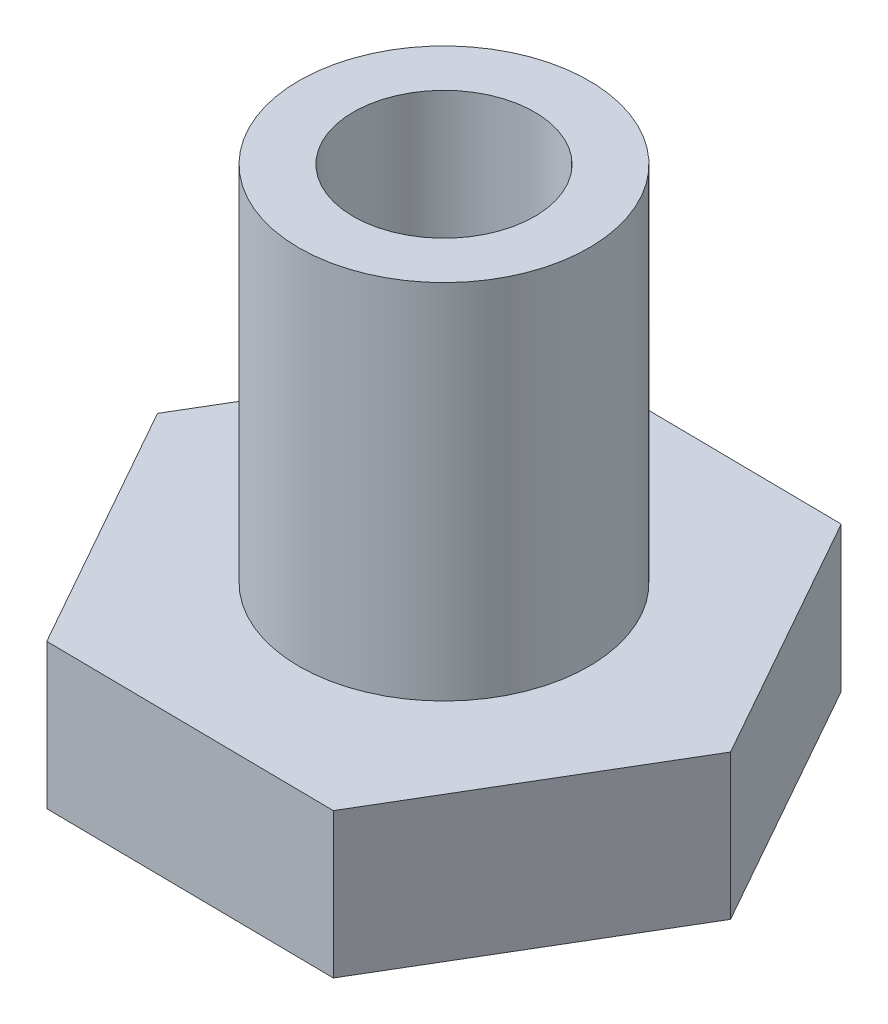
ISO-10303-21;
HEADER;
FILE_DESCRIPTION(('STEP AP214'),'2;1');
FILE_NAME('part.step','',(''),(''),'','','');
FILE_SCHEMA(('AUTOMOTIVE_DESIGN { 1 0 10303 214 1 1 1 1 }'));
ENDSEC;
DATA;
#1=APPLICATION_CONTEXT('core data for automotive mechanical design processes');
#2=APPLICATION_PROTOCOL_DEFINITION('international standard','automotive_design',2000,#1);
#3=PRODUCT_CONTEXT('',#1,'mechanical');
#4=PRODUCT('Part','Part','',(#3));
#5=PRODUCT_RELATED_PRODUCT_CATEGORY('part','',(#4));
#6=PRODUCT_DEFINITION_FORMATION('','',#4);
#7=PRODUCT_DEFINITION_CONTEXT('part definition',#1,'design');
#8=PRODUCT_DEFINITION('design','',#6,#7);
#9=PRODUCT_DEFINITION_SHAPE('','',#8);
#10=(LENGTH_UNIT() NAMED_UNIT(*) SI_UNIT(.MILLI.,.METRE.));
#11=(NAMED_UNIT(*) PLANE_ANGLE_UNIT() SI_UNIT($,.RADIAN.));
#12=(NAMED_UNIT(*) SI_UNIT($,.STERADIAN.) SOLID_ANGLE_UNIT());
#13=UNCERTAINTY_MEASURE_WITH_UNIT(LENGTH_MEASURE(1.E-05),#10,'distance_accuracy_value','');
#14=(GEOMETRIC_REPRESENTATION_CONTEXT(3) GLOBAL_UNCERTAINTY_ASSIGNED_CONTEXT((#13)) GLOBAL_UNIT_ASSIGNED_CONTEXT((#10,
#11,#12)) REPRESENTATION_CONTEXT('',''));
#15=CARTESIAN_POINT('',(0.,0.,0.));
#16=DIRECTION('',(0.,0.,1.));
#17=DIRECTION('',(1.,0.,0.));
#18=AXIS2_PLACEMENT_3D('',#15,#16,#17);
#19=CARTESIAN_POINT('',(-8.16049290973591,8.,13.763745835912));
#20=DIRECTION('',(0.011581801221208,0.,-0.999932928690956));
#21=DIRECTION('',(-0.999932928690956,0.,-0.011581801221208));
#22=AXIS2_PLACEMENT_3D('',#19,#20,#21);
#23=PLANE('',#22);
#24=DIRECTION('',(0.999932928690956,0.,0.011581801221208));
#25=VECTOR('',#24,1.);
#26=CARTESIAN_POINT('',(-8.16049290973591,0.,13.763745835912));
#27=LINE('',#26,#25);
#28=CARTESIAN_POINT('',(-8.16049290973591,0.,13.763745835912));
#29=VERTEX_POINT('',#28);
#30=CARTESIAN_POINT('',(7.83950709026409,0.,13.9490670851901));
#31=VERTEX_POINT('',#30);
#32=EDGE_CURVE('E134',#29,#31,#27,.T.);
#33=ORIENTED_EDGE('',*,*,#32,.T.);
#34=DIRECTION('',(0.,-1.,0.));
#35=VECTOR('',#34,1.);
#36=CARTESIAN_POINT('',(7.83950709026409,8.,13.9490670851901));
#37=LINE('',#36,#35);
#38=CARTESIAN_POINT('',(7.83950709026409,8.,13.9490670851901));
#39=VERTEX_POINT('',#38);
#40=EDGE_CURVE('E46',#39,#31,#37,.T.);
#41=ORIENTED_EDGE('',*,*,#40,.F.);
#42=DIRECTION('',(0.999932928690956,0.,0.011581801221208));
#43=VECTOR('',#42,1.);
#44=CARTESIAN_POINT('',(-8.16049290973591,8.,13.763745835912));
#45=LINE('',#44,#43);
#46=CARTESIAN_POINT('',(-8.16049290973591,8.,13.763745835912));
#47=VERTEX_POINT('',#46);
#48=EDGE_CURVE('E151',#47,#39,#45,.T.);
#49=ORIENTED_EDGE('',*,*,#48,.F.);
#50=DIRECTION('',(0.,-1.,0.));
#51=VECTOR('',#50,1.);
#52=CARTESIAN_POINT('',(-8.16049290973591,8.,13.763745835912));
#53=LINE('',#52,#51);
#54=EDGE_CURVE('E130',#47,#29,#53,.T.);
#55=ORIENTED_EDGE('',*,*,#54,.T.);
#56=EDGE_LOOP('',(#33,#41,#49,#55));
#57=FACE_BOUND('',#56,.T.);
#58=ADVANCED_FACE('F43',(#57),#23,.F.);
#59=CARTESIAN_POINT('',(7.83950709026409,8.,13.9490670851901));
#60=DIRECTION('',(-0.860176417716338,0.,-0.509996598424626));
#61=DIRECTION('',(-0.509996598424626,0.,0.860176417716338));
#62=AXIS2_PLACEMENT_3D('',#59,#60,#61);
#63=PLANE('',#62);
#64=DIRECTION('',(0.509996598424626,0.,-0.860176417716338));
#65=VECTOR('',#64,1.);
#66=CARTESIAN_POINT('',(7.83950709026409,0.,13.9490670851901));
#67=LINE('',#66,#65);
#68=CARTESIAN_POINT('',(16.,0.,0.185321249278104));
#69=VERTEX_POINT('',#68);
#70=EDGE_CURVE('E138',#31,#69,#67,.T.);
#71=ORIENTED_EDGE('',*,*,#70,.T.);
#72=DIRECTION('',(0.,-1.,0.));
#73=VECTOR('',#72,1.);
#74=CARTESIAN_POINT('',(16.,8.,0.185321249278104));
#75=LINE('',#74,#73);
#76=CARTESIAN_POINT('',(16.,8.,0.185321249278104));
#77=VERTEX_POINT('',#76);
#78=EDGE_CURVE('E157',#77,#69,#75,.T.);
#79=ORIENTED_EDGE('',*,*,#78,.F.);
#80=DIRECTION('',(0.509996598424626,0.,-0.860176417716338));
#81=VECTOR('',#80,1.);
#82=CARTESIAN_POINT('',(7.83950709026409,8.,13.9490670851901));
#83=LINE('',#82,#81);
#84=EDGE_CURVE('E99',#39,#77,#83,.T.);
#85=ORIENTED_EDGE('',*,*,#84,.F.);
#86=ORIENTED_EDGE('',*,*,#40,.T.);
#87=EDGE_LOOP('',(#71,#79,#85,#86));
#88=FACE_BOUND('',#87,.T.);
#89=ADVANCED_FACE('F164',(#88),#63,.F.);
#90=CARTESIAN_POINT('',(16.,8.,0.185321249278104));
#91=DIRECTION('',(-0.871758218937545,0.,0.48993633026633));
#92=DIRECTION('',(0.48993633026633,0.,0.871758218937545));
#93=AXIS2_PLACEMENT_3D('',#90,#91,#92);
#94=PLANE('',#93);
#95=DIRECTION('',(-0.48993633026633,0.,-0.871758218937545));
#96=VECTOR('',#95,1.);
#97=CARTESIAN_POINT('',(16.,0.,0.185321249278104));
#98=LINE('',#97,#96);
#99=CARTESIAN_POINT('',(8.16049290973591,0.,-13.763745835912));
#100=VERTEX_POINT('',#99);
#101=EDGE_CURVE('E142',#69,#100,#98,.T.);
#102=ORIENTED_EDGE('',*,*,#101,.T.);
#103=DIRECTION('',(0.,-1.,0.));
#104=VECTOR('',#103,1.);
#105=CARTESIAN_POINT('',(8.16049290973591,8.,-13.763745835912));
#106=LINE('',#105,#104);
#107=CARTESIAN_POINT('',(8.16049290973591,8.,-13.763745835912));
#108=VERTEX_POINT('',#107);
#109=EDGE_CURVE('E123',#108,#100,#106,.T.);
#110=ORIENTED_EDGE('',*,*,#109,.F.);
#111=DIRECTION('',(-0.48993633026633,0.,-0.871758218937545));
#112=VECTOR('',#111,1.);
#113=CARTESIAN_POINT('',(16.,8.,0.185321249278104));
#114=LINE('',#113,#112);
#115=EDGE_CURVE('E112',#77,#108,#114,.T.);
#116=ORIENTED_EDGE('',*,*,#115,.F.);
#117=ORIENTED_EDGE('',*,*,#78,.T.);
#118=EDGE_LOOP('',(#102,#110,#116,#117));
#119=FACE_BOUND('',#118,.T.);
#120=ADVANCED_FACE('F170',(#119),#94,.F.);
#121=CARTESIAN_POINT('',(8.16049290973591,8.,-13.763745835912));
#122=DIRECTION('',(-0.0115818012212078,0.,0.999932928690956));
#123=DIRECTION('',(0.999932928690956,0.,0.0115818012212078));
#124=AXIS2_PLACEMENT_3D('',#121,#122,#123);
#125=PLANE('',#124);
#126=DIRECTION('',(-0.999932928690956,0.,-0.0115818012212078));
#127=VECTOR('',#126,1.);
#128=CARTESIAN_POINT('',(8.16049290973591,0.,-13.763745835912));
#129=LINE('',#128,#127);
#130=CARTESIAN_POINT('',(-7.83950709026409,0.,-13.9490670851901));
#131=VERTEX_POINT('',#130);
#132=EDGE_CURVE('E121',#100,#131,#129,.T.);
#133=ORIENTED_EDGE('',*,*,#132,.T.);
#134=DIRECTION('',(0.,-1.,0.));
#135=VECTOR('',#134,1.);
#136=CARTESIAN_POINT('',(-7.83950709026409,8.,-13.9490670851901));
#137=LINE('',#136,#135);
#138=CARTESIAN_POINT('',(-7.83950709026409,8.,-13.9490670851901));
#139=VERTEX_POINT('',#138);
#140=EDGE_CURVE('E118',#139,#131,#137,.T.);
#141=ORIENTED_EDGE('',*,*,#140,.F.);
#142=DIRECTION('',(-0.999932928690956,0.,-0.0115818012212078));
#143=VECTOR('',#142,1.);
#144=CARTESIAN_POINT('',(8.16049290973591,8.,-13.763745835912));
#145=LINE('',#144,#143);
#146=EDGE_CURVE('E106',#108,#139,#145,.T.);
#147=ORIENTED_EDGE('',*,*,#146,.F.);
#148=ORIENTED_EDGE('',*,*,#109,.T.);
#149=EDGE_LOOP('',(#133,#141,#147,#148));
#150=FACE_BOUND('',#149,.T.);
#151=ADVANCED_FACE('F119',(#150),#125,.F.);
#152=CARTESIAN_POINT('',(-7.83950709026409,8.,-13.9490670851901));
#153=DIRECTION('',(0.860176417716337,0.,0.509996598424626));
#154=DIRECTION('',(0.509996598424626,0.,-0.860176417716337));
#155=AXIS2_PLACEMENT_3D('',#152,#153,#154);
#156=PLANE('',#155);
#157=DIRECTION('',(-0.509996598424626,0.,0.860176417716337));
#158=VECTOR('',#157,1.);
#159=CARTESIAN_POINT('',(-7.83950709026409,0.,-13.9490670851901));
#160=LINE('',#159,#158);
#161=CARTESIAN_POINT('',(-16.,0.,-0.185321249278107));
#162=VERTEX_POINT('',#161);
#163=EDGE_CURVE('E84',#131,#162,#160,.T.);
#164=ORIENTED_EDGE('',*,*,#163,.T.);
#165=DIRECTION('',(0.,-1.,0.));
#166=VECTOR('',#165,1.);
#167=CARTESIAN_POINT('',(-16.,8.,-0.185321249278107));
#168=LINE('',#167,#166);
#169=CARTESIAN_POINT('',(-16.,8.,-0.185321249278107));
#170=VERTEX_POINT('',#169);
#171=EDGE_CURVE('E124',#170,#162,#168,.T.);
#172=ORIENTED_EDGE('',*,*,#171,.F.);
#173=DIRECTION('',(-0.509996598424626,0.,0.860176417716337));
#174=VECTOR('',#173,1.);
#175=CARTESIAN_POINT('',(-7.83950709026409,8.,-13.9490670851901));
#176=LINE('',#175,#174);
#177=EDGE_CURVE('E110',#139,#170,#176,.T.);
#178=ORIENTED_EDGE('',*,*,#177,.F.);
#179=ORIENTED_EDGE('',*,*,#140,.T.);
#180=EDGE_LOOP('',(#164,#172,#178,#179));
#181=FACE_BOUND('',#180,.T.);
#182=ADVANCED_FACE('F126',(#181),#156,.F.);
#183=CARTESIAN_POINT('',(-16.,8.,-0.185321249278107));
#184=DIRECTION('',(0.871758218937545,0.,-0.489936330266331));
#185=DIRECTION('',(-0.489936330266331,0.,-0.871758218937545));
#186=AXIS2_PLACEMENT_3D('',#183,#184,#185);
#187=PLANE('',#186);
#188=DIRECTION('',(0.489936330266331,0.,0.871758218937545));
#189=VECTOR('',#188,1.);
#190=CARTESIAN_POINT('',(-16.,0.,-0.185321249278107));
#191=LINE('',#190,#189);
#192=EDGE_CURVE('E90',#162,#29,#191,.T.);
#193=ORIENTED_EDGE('',*,*,#192,.T.);
#194=ORIENTED_EDGE('',*,*,#54,.F.);
#195=DIRECTION('',(0.489936330266331,0.,0.871758218937545));
#196=VECTOR('',#195,1.);
#197=CARTESIAN_POINT('',(-16.,8.,-0.185321249278107));
#198=LINE('',#197,#196);
#199=EDGE_CURVE('E61',#170,#47,#198,.T.);
#200=ORIENTED_EDGE('',*,*,#199,.F.);
#201=ORIENTED_EDGE('',*,*,#171,.T.);
#202=EDGE_LOOP('',(#193,#194,#200,#201));
#203=FACE_BOUND('',#202,.T.);
#204=ADVANCED_FACE('F210',(#203),#187,.F.);
#205=CARTESIAN_POINT('',(0.,8.,0.));
#206=DIRECTION('',(0.,1.,0.));
#207=DIRECTION('',(0.,0.,1.));
#208=AXIS2_PLACEMENT_3D('',#205,#206,#207);
#209=PLANE('',#208);
#210=CARTESIAN_POINT('',(0.,8.,0.));
#211=DIRECTION('',(0.,1.,0.));
#212=DIRECTION('',(0.,0.,1.));
#213=AXIS2_PLACEMENT_3D('',#210,#211,#212);
#214=CIRCLE('',#213,8.);
#215=CARTESIAN_POINT('',(0.,8.,8.));
#216=VERTEX_POINT('',#215);
#217=EDGE_CURVE('E11',#216,#216,#214,.T.);
#218=ORIENTED_EDGE('',*,*,#217,.F.);
#219=EDGE_LOOP('',(#218));
#220=FACE_BOUND('',#219,.T.);
#221=ORIENTED_EDGE('',*,*,#48,.T.);
#222=ORIENTED_EDGE('',*,*,#84,.T.);
#223=ORIENTED_EDGE('',*,*,#115,.T.);
#224=ORIENTED_EDGE('',*,*,#146,.T.);
#225=ORIENTED_EDGE('',*,*,#177,.T.);
#226=ORIENTED_EDGE('',*,*,#199,.T.);
#227=EDGE_LOOP('',(#221,#222,#223,#224,#225,#226));
#228=FACE_BOUND('',#227,.T.);
#229=ADVANCED_FACE('F108',(#220,#228),#209,.T.);
#230=CARTESIAN_POINT('',(0.,0.,0.));
#231=DIRECTION('',(0.,1.,0.));
#232=DIRECTION('',(0.,0.,1.));
#233=AXIS2_PLACEMENT_3D('',#230,#231,#232);
#234=PLANE('',#233);
#235=ORIENTED_EDGE('',*,*,#32,.F.);
#236=ORIENTED_EDGE('',*,*,#192,.F.);
#237=ORIENTED_EDGE('',*,*,#163,.F.);
#238=ORIENTED_EDGE('',*,*,#132,.F.);
#239=ORIENTED_EDGE('',*,*,#101,.F.);
#240=ORIENTED_EDGE('',*,*,#70,.F.);
#241=EDGE_LOOP('',(#235,#236,#237,#238,#239,#240));
#242=FACE_BOUND('',#241,.T.);
#243=ADVANCED_FACE('F169',(#242),#234,.F.);
#244=CARTESIAN_POINT('',(0.,28.,0.));
#245=DIRECTION('',(0.,-1.,0.));
#246=DIRECTION('',(0.,0.,-1.));
#247=AXIS2_PLACEMENT_3D('',#244,#245,#246);
#248=CYLINDRICAL_SURFACE('',#247,8.);
#249=CARTESIAN_POINT('',(0.,28.,0.));
#250=DIRECTION('',(0.,1.,0.));
#251=DIRECTION('',(0.,0.,1.));
#252=AXIS2_PLACEMENT_3D('',#249,#250,#251);
#253=CIRCLE('',#252,8.);
#254=CARTESIAN_POINT('',(0.,28.,8.));
#255=VERTEX_POINT('',#254);
#256=EDGE_CURVE('E139',#255,#255,#253,.T.);
#257=ORIENTED_EDGE('',*,*,#256,.F.);
#258=EDGE_LOOP('',(#257));
#259=FACE_BOUND('',#258,.T.);
#260=ORIENTED_EDGE('',*,*,#217,.T.);
#261=EDGE_LOOP('',(#260));
#262=FACE_BOUND('',#261,.T.);
#263=ADVANCED_FACE('F200',(#259,#262),#248,.T.);
#264=CARTESIAN_POINT('',(0.,28.,0.));
#265=DIRECTION('',(0.,1.,0.));
#266=DIRECTION('',(0.,0.,1.));
#267=AXIS2_PLACEMENT_3D('',#264,#265,#266);
#268=PLANE('',#267);
#269=CARTESIAN_POINT('',(0.,28.,0.));
#270=DIRECTION('',(0.,1.,0.));
#271=DIRECTION('',(0.,0.,1.));
#272=AXIS2_PLACEMENT_3D('',#269,#270,#271);
#273=CIRCLE('',#272,5.);
#274=CARTESIAN_POINT('',(0.,28.,5.));
#275=VERTEX_POINT('',#274);
#276=EDGE_CURVE('E181',#275,#275,#273,.T.);
#277=ORIENTED_EDGE('',*,*,#276,.F.);
#278=EDGE_LOOP('',(#277));
#279=FACE_BOUND('',#278,.T.);
#280=ORIENTED_EDGE('',*,*,#256,.T.);
#281=EDGE_LOOP('',(#280));
#282=FACE_BOUND('',#281,.T.);
#283=ADVANCED_FACE('F194',(#279,#282),#268,.T.);
#284=CARTESIAN_POINT('',(0.,8.,0.));
#285=DIRECTION('',(0.,1.,0.));
#286=DIRECTION('',(0.,0.,1.));
#287=AXIS2_PLACEMENT_3D('',#284,#285,#286);
#288=CYLINDRICAL_SURFACE('',#287,5.);
#289=CARTESIAN_POINT('',(0.,8.,0.));
#290=DIRECTION('',(0.,1.,0.));
#291=DIRECTION('',(0.,0.,1.));
#292=AXIS2_PLACEMENT_3D('',#289,#290,#291);
#293=CIRCLE('',#292,5.);
#294=CARTESIAN_POINT('',(0.,8.,5.));
#295=VERTEX_POINT('',#294);
#296=EDGE_CURVE('E180',#295,#295,#293,.T.);
#297=ORIENTED_EDGE('',*,*,#296,.F.);
#298=EDGE_LOOP('',(#297));
#299=FACE_BOUND('',#298,.T.);
#300=ORIENTED_EDGE('',*,*,#276,.T.);
#301=EDGE_LOOP('',(#300));
#302=FACE_BOUND('',#301,.T.);
#303=ADVANCED_FACE('F191',(#299,#302),#288,.F.);
#304=CARTESIAN_POINT('',(0.,8.,0.));
#305=DIRECTION('',(0.,1.,0.));
#306=DIRECTION('',(0.,0.,1.));
#307=AXIS2_PLACEMENT_3D('',#304,#305,#306);
#308=PLANE('',#307);
#309=ORIENTED_EDGE('',*,*,#296,.T.);
#310=EDGE_LOOP('',(#309));
#311=FACE_BOUND('',#310,.T.);
#312=ADVANCED_FACE('F189',(#311),#308,.T.);
#313=CLOSED_SHELL('',(#58,#89,#120,#151,#182,#204,#229,#243,#263,#283,#303,#312));
#314=MANIFOLD_SOLID_BREP('B2',#313);
#315=ADVANCED_BREP_SHAPE_REPRESENTATION('',(#18,#314),#14);
#316=SHAPE_DEFINITION_REPRESENTATION(#9,#315);
ENDSEC;
END-ISO-10303-21;
